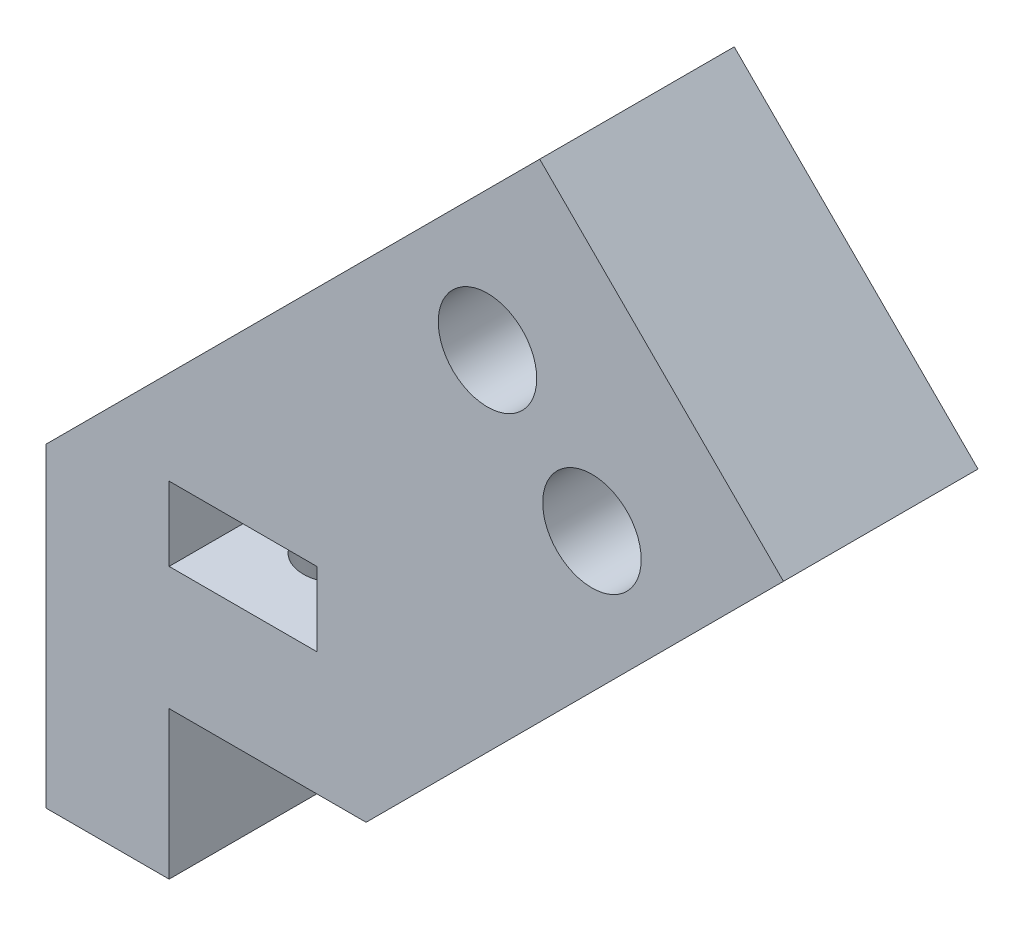
ISO-10303-21;
HEADER;
FILE_DESCRIPTION(('STEP AP214'),'2;1');
FILE_NAME('part.step','',(''),(''),'','','');
FILE_SCHEMA(('AUTOMOTIVE_DESIGN { 1 0 10303 214 1 1 1 1 }'));
ENDSEC;
DATA;
#1=APPLICATION_CONTEXT('core data for automotive mechanical design processes');
#2=APPLICATION_PROTOCOL_DEFINITION('international standard','automotive_design',2000,#1);
#3=PRODUCT_CONTEXT('',#1,'mechanical');
#4=PRODUCT('Part','Part','',(#3));
#5=PRODUCT_RELATED_PRODUCT_CATEGORY('part','',(#4));
#6=PRODUCT_DEFINITION_FORMATION('','',#4);
#7=PRODUCT_DEFINITION_CONTEXT('part definition',#1,'design');
#8=PRODUCT_DEFINITION('design','',#6,#7);
#9=PRODUCT_DEFINITION_SHAPE('','',#8);
#10=(LENGTH_UNIT() NAMED_UNIT(*) SI_UNIT(.MILLI.,.METRE.));
#11=(NAMED_UNIT(*) PLANE_ANGLE_UNIT() SI_UNIT($,.RADIAN.));
#12=(NAMED_UNIT(*) SI_UNIT($,.STERADIAN.) SOLID_ANGLE_UNIT());
#13=UNCERTAINTY_MEASURE_WITH_UNIT(LENGTH_MEASURE(1.E-05),#10,'distance_accuracy_value','');
#14=(GEOMETRIC_REPRESENTATION_CONTEXT(3) GLOBAL_UNCERTAINTY_ASSIGNED_CONTEXT((#13)) GLOBAL_UNIT_ASSIGNED_CONTEXT((#10,
#11,#12)) REPRESENTATION_CONTEXT('',''));
#15=CARTESIAN_POINT('',(0.,0.,0.));
#16=DIRECTION('',(0.,0.,1.));
#17=DIRECTION('',(1.,0.,0.));
#18=AXIS2_PLACEMENT_3D('',#15,#16,#17);
#19=CARTESIAN_POINT('',(-27.,32.8492424049175,-3.95));
#20=DIRECTION('',(0.,-1.,0.));
#21=DIRECTION('',(0.,0.,-1.));
#22=AXIS2_PLACEMENT_3D('',#19,#20,#21);
#23=CYLINDRICAL_SURFACE('',#22,1.5);
#24=CARTESIAN_POINT('',(-27.,14.,-3.95));
#25=DIRECTION('',(0.,1.,0.));
#26=DIRECTION('',(0.,0.,1.));
#27=AXIS2_PLACEMENT_3D('',#24,#25,#26);
#28=CIRCLE('',#27,1.5);
#29=CARTESIAN_POINT('',(-27.,14.,-2.45));
#30=VERTEX_POINT('',#29);
#31=EDGE_CURVE('E37',#30,#30,#28,.F.);
#32=ORIENTED_EDGE('',*,*,#31,.T.);
#33=EDGE_LOOP('',(#32));
#34=FACE_BOUND('',#33,.T.);
#35=CARTESIAN_POINT('',(-27.,20.7989898732233,-3.95));
#36=DIRECTION('',(-0.707106781186548,0.707106781186548,0.));
#37=DIRECTION('',(-0.707106781186548,-0.707106781186548,0.));
#38=AXIS2_PLACEMENT_3D('',#35,#36,#37);
#39=ELLIPSE('',#38,2.12132034355964,1.5);
#40=CARTESIAN_POINT('',(-28.5,19.2989898732233,-3.95));
#41=VERTEX_POINT('',#40);
#42=EDGE_CURVE('E158',#41,#41,#39,.T.);
#43=ORIENTED_EDGE('',*,*,#42,.T.);
#44=EDGE_LOOP('',(#43));
#45=FACE_BOUND('',#44,.T.);
#46=ADVANCED_FACE('F33',(#34,#45),#23,.F.);
#47=CARTESIAN_POINT('',(-30.,0.,-52.3528975432684));
#48=DIRECTION('',(1.,0.,0.));
#49=DIRECTION('',(0.,0.,-1.));
#50=AXIS2_PLACEMENT_3D('',#47,#48,#49);
#51=PLANE('',#50);
#52=DIRECTION('',(0.,-1.,0.));
#53=VECTOR('',#52,1.);
#54=CARTESIAN_POINT('',(-30.,0.,-7.9));
#55=LINE('',#54,#53);
#56=CARTESIAN_POINT('',(-30.,6.,-7.90000000000002));
#57=VERTEX_POINT('',#56);
#58=CARTESIAN_POINT('',(-30.,0.,-7.9));
#59=VERTEX_POINT('',#58);
#60=EDGE_CURVE('E160',#57,#59,#55,.T.);
#61=ORIENTED_EDGE('',*,*,#60,.F.);
#62=DIRECTION('',(0.,0.,1.));
#63=VECTOR('',#62,1.);
#64=CARTESIAN_POINT('',(-30.,6.,-52.3528975432684));
#65=LINE('',#64,#63);
#66=CARTESIAN_POINT('',(-30.,6.,0.));
#67=VERTEX_POINT('',#66);
#68=EDGE_CURVE('E212',#57,#67,#65,.T.);
#69=ORIENTED_EDGE('',*,*,#68,.T.);
#70=DIRECTION('',(0.,1.,0.));
#71=VECTOR('',#70,1.);
#72=CARTESIAN_POINT('',(-30.,0.,0.));
#73=LINE('',#72,#71);
#74=CARTESIAN_POINT('',(-30.,0.,0.));
#75=VERTEX_POINT('',#74);
#76=EDGE_CURVE('E184',#75,#67,#73,.T.);
#77=ORIENTED_EDGE('',*,*,#76,.F.);
#78=DIRECTION('',(0.,0.,1.));
#79=VECTOR('',#78,1.);
#80=CARTESIAN_POINT('',(-30.,0.,-52.3528975432684));
#81=LINE('',#80,#79);
#82=EDGE_CURVE('E202',#59,#75,#81,.T.);
#83=ORIENTED_EDGE('',*,*,#82,.F.);
#84=EDGE_LOOP('',(#61,#69,#77,#83));
#85=FACE_BOUND('',#84,.T.);
#86=ADVANCED_FACE('F239',(#85),#51,.T.);
#87=CARTESIAN_POINT('',(-30.,6.,-52.3528975432684));
#88=DIRECTION('',(0.,-1.,0.));
#89=DIRECTION('',(0.,0.,-1.));
#90=AXIS2_PLACEMENT_3D('',#87,#88,#89);
#91=PLANE('',#90);
#92=CARTESIAN_POINT('',(-27.,6.,-3.95));
#93=DIRECTION('',(0.,-1.,0.));
#94=DIRECTION('',(0.,0.,-1.));
#95=AXIS2_PLACEMENT_3D('',#92,#93,#94);
#96=CIRCLE('',#95,1.5);
#97=CARTESIAN_POINT('',(-27.,6.,-5.45));
#98=VERTEX_POINT('',#97);
#99=EDGE_CURVE('E156',#98,#98,#96,.T.);
#100=ORIENTED_EDGE('',*,*,#99,.F.);
#101=EDGE_LOOP('',(#100));
#102=FACE_BOUND('',#101,.T.);
#103=DIRECTION('',(-1.,0.,0.));
#104=VECTOR('',#103,1.);
#105=CARTESIAN_POINT('',(-30.,6.,-7.9));
#106=LINE('',#105,#104);
#107=CARTESIAN_POINT('',(-22.,6.,-7.9));
#108=VERTEX_POINT('',#107);
#109=EDGE_CURVE('E163',#108,#57,#106,.T.);
#110=ORIENTED_EDGE('',*,*,#109,.F.);
#111=DIRECTION('',(0.,0.,1.));
#112=VECTOR('',#111,1.);
#113=CARTESIAN_POINT('',(-22.,6.,-52.3528975432684));
#114=LINE('',#113,#112);
#115=CARTESIAN_POINT('',(-22.,6.,0.));
#116=VERTEX_POINT('',#115);
#117=EDGE_CURVE('E210',#108,#116,#114,.T.);
#118=ORIENTED_EDGE('',*,*,#117,.T.);
#119=DIRECTION('',(1.,0.,0.));
#120=VECTOR('',#119,1.);
#121=CARTESIAN_POINT('',(-30.,6.,0.));
#122=LINE('',#121,#120);
#123=EDGE_CURVE('E187',#67,#116,#122,.T.);
#124=ORIENTED_EDGE('',*,*,#123,.F.);
#125=ORIENTED_EDGE('',*,*,#68,.F.);
#126=EDGE_LOOP('',(#110,#118,#124,#125));
#127=FACE_BOUND('',#126,.T.);
#128=ADVANCED_FACE('F243',(#102,#127),#91,.T.);
#129=CARTESIAN_POINT('',(-22.,6.,-52.3528975432684));
#130=DIRECTION('',(0.707106781186547,-0.707106781186548,0.));
#131=DIRECTION('',(0.707106781186548,0.707106781186547,0.));
#132=AXIS2_PLACEMENT_3D('',#129,#130,#131);
#133=PLANE('',#132);
#134=DIRECTION('',(-0.707106781186548,-0.707106781186547,0.));
#135=VECTOR('',#134,1.);
#136=CARTESIAN_POINT('',(-22.,6.,-7.9));
#137=LINE('',#136,#135);
#138=CARTESIAN_POINT('',(-5.05025253169416,22.9497474683058,-7.9));
#139=VERTEX_POINT('',#138);
#140=EDGE_CURVE('E165',#139,#108,#137,.T.);
#141=ORIENTED_EDGE('',*,*,#140,.F.);
#142=DIRECTION('',(0.,0.,1.));
#143=VECTOR('',#142,1.);
#144=CARTESIAN_POINT('',(-5.05025253169416,22.9497474683058,-52.3528975432684));
#145=LINE('',#144,#143);
#146=CARTESIAN_POINT('',(-5.05025253169416,22.9497474683058,0.));
#147=VERTEX_POINT('',#146);
#148=EDGE_CURVE('E208',#139,#147,#145,.T.);
#149=ORIENTED_EDGE('',*,*,#148,.T.);
#150=DIRECTION('',(0.707106781186548,0.707106781186547,0.));
#151=VECTOR('',#150,1.);
#152=CARTESIAN_POINT('',(-22.,6.,0.));
#153=LINE('',#152,#151);
#154=EDGE_CURVE('E190',#116,#147,#153,.T.);
#155=ORIENTED_EDGE('',*,*,#154,.F.);
#156=ORIENTED_EDGE('',*,*,#117,.F.);
#157=EDGE_LOOP('',(#141,#149,#155,#156));
#158=FACE_BOUND('',#157,.T.);
#159=ADVANCED_FACE('F272',(#158),#133,.T.);
#160=CARTESIAN_POINT('',(-5.05025253169416,22.9497474683058,-52.3528975432684));
#161=DIRECTION('',(0.707106781186548,0.707106781186547,0.));
#162=DIRECTION('',(-0.707106781186547,0.707106781186548,0.));
#163=AXIS2_PLACEMENT_3D('',#160,#161,#162);
#164=PLANE('',#163);
#165=DIRECTION('',(0.707106781186547,-0.707106781186548,0.));
#166=VECTOR('',#165,1.);
#167=CARTESIAN_POINT('',(-5.05025253169416,22.9497474683058,-7.9));
#168=LINE('',#167,#166);
#169=CARTESIAN_POINT('',(-14.9497474683058,32.8492424049175,-7.9));
#170=VERTEX_POINT('',#169);
#171=EDGE_CURVE('E168',#170,#139,#168,.T.);
#172=ORIENTED_EDGE('',*,*,#171,.F.);
#173=DIRECTION('',(0.,0.,1.));
#174=VECTOR('',#173,1.);
#175=CARTESIAN_POINT('',(-14.9497474683058,32.8492424049175,-52.3528975432684));
#176=LINE('',#175,#174);
#177=CARTESIAN_POINT('',(-14.9497474683058,32.8492424049175,0.));
#178=VERTEX_POINT('',#177);
#179=EDGE_CURVE('E206',#170,#178,#176,.T.);
#180=ORIENTED_EDGE('',*,*,#179,.T.);
#181=DIRECTION('',(-0.707106781186547,0.707106781186548,0.));
#182=VECTOR('',#181,1.);
#183=CARTESIAN_POINT('',(-5.05025253169416,22.9497474683058,0.));
#184=LINE('',#183,#182);
#185=EDGE_CURVE('E193',#147,#178,#184,.T.);
#186=ORIENTED_EDGE('',*,*,#185,.F.);
#187=ORIENTED_EDGE('',*,*,#148,.F.);
#188=EDGE_LOOP('',(#172,#180,#186,#187));
#189=FACE_BOUND('',#188,.T.);
#190=ADVANCED_FACE('F268',(#189),#164,.T.);
#191=CARTESIAN_POINT('',(-14.9497474683058,32.8492424049175,-52.3528975432684));
#192=DIRECTION('',(-0.707106781186548,0.707106781186548,0.));
#193=DIRECTION('',(-0.707106781186548,-0.707106781186548,0.));
#194=AXIS2_PLACEMENT_3D('',#191,#192,#193);
#195=PLANE('',#194);
#196=ORIENTED_EDGE('',*,*,#42,.F.);
#197=EDGE_LOOP('',(#196));
#198=FACE_BOUND('',#197,.T.);
#199=DIRECTION('',(0.707106781186548,0.707106781186548,0.));
#200=VECTOR('',#199,1.);
#201=CARTESIAN_POINT('',(-14.9497474683058,32.8492424049175,-7.9));
#202=LINE('',#201,#200);
#203=CARTESIAN_POINT('',(-35.,12.7989898732233,-7.9));
#204=VERTEX_POINT('',#203);
#205=EDGE_CURVE('E170',#204,#170,#202,.T.);
#206=ORIENTED_EDGE('',*,*,#205,.F.);
#207=DIRECTION('',(0.,0.,1.));
#208=VECTOR('',#207,1.);
#209=CARTESIAN_POINT('',(-35.,12.7989898732233,-52.3528975432684));
#210=LINE('',#209,#208);
#211=CARTESIAN_POINT('',(-35.,12.7989898732233,0.));
#212=VERTEX_POINT('',#211);
#213=EDGE_CURVE('E204',#204,#212,#210,.T.);
#214=ORIENTED_EDGE('',*,*,#213,.T.);
#215=DIRECTION('',(-0.707106781186547,-0.707106781186547,0.));
#216=VECTOR('',#215,1.);
#217=CARTESIAN_POINT('',(-14.9497474683058,32.8492424049175,0.));
#218=LINE('',#217,#216);
#219=EDGE_CURVE('E196',#178,#212,#218,.T.);
#220=ORIENTED_EDGE('',*,*,#219,.F.);
#221=ORIENTED_EDGE('',*,*,#179,.F.);
#222=EDGE_LOOP('',(#206,#214,#220,#221));
#223=FACE_BOUND('',#222,.T.);
#224=ADVANCED_FACE('F264',(#198,#223),#195,.T.);
#225=CARTESIAN_POINT('',(-35.,12.7989898732233,-52.3528975432684));
#226=DIRECTION('',(-1.,0.,0.));
#227=DIRECTION('',(0.,0.,1.));
#228=AXIS2_PLACEMENT_3D('',#225,#226,#227);
#229=PLANE('',#228);
#230=DIRECTION('',(0.,1.,0.));
#231=VECTOR('',#230,1.);
#232=CARTESIAN_POINT('',(-35.,12.7989898732233,-7.9));
#233=LINE('',#232,#231);
#234=CARTESIAN_POINT('',(-35.,0.,-7.9));
#235=VERTEX_POINT('',#234);
#236=EDGE_CURVE('E172',#235,#204,#233,.T.);
#237=ORIENTED_EDGE('',*,*,#236,.F.);
#238=DIRECTION('',(0.,0.,1.));
#239=VECTOR('',#238,1.);
#240=CARTESIAN_POINT('',(-35.,0.,-52.3528975432684));
#241=LINE('',#240,#239);
#242=CARTESIAN_POINT('',(-35.,0.,0.));
#243=VERTEX_POINT('',#242);
#244=EDGE_CURVE('E166',#235,#243,#241,.T.);
#245=ORIENTED_EDGE('',*,*,#244,.T.);
#246=DIRECTION('',(0.,-1.,0.));
#247=VECTOR('',#246,1.);
#248=CARTESIAN_POINT('',(-35.,12.7989898732233,0.));
#249=LINE('',#248,#247);
#250=EDGE_CURVE('E199',#212,#243,#249,.T.);
#251=ORIENTED_EDGE('',*,*,#250,.F.);
#252=ORIENTED_EDGE('',*,*,#213,.F.);
#253=EDGE_LOOP('',(#237,#245,#251,#252));
#254=FACE_BOUND('',#253,.T.);
#255=ADVANCED_FACE('F261',(#254),#229,.T.);
#256=CARTESIAN_POINT('',(-35.,0.,-52.3528975432684));
#257=DIRECTION('',(0.,-1.,0.));
#258=DIRECTION('',(0.,0.,-1.));
#259=AXIS2_PLACEMENT_3D('',#256,#257,#258);
#260=PLANE('',#259);
#261=DIRECTION('',(-1.,0.,0.));
#262=VECTOR('',#261,1.);
#263=CARTESIAN_POINT('',(-35.,0.,-7.9));
#264=LINE('',#263,#262);
#265=EDGE_CURVE('E162',#59,#235,#264,.T.);
#266=ORIENTED_EDGE('',*,*,#265,.F.);
#267=ORIENTED_EDGE('',*,*,#82,.T.);
#268=DIRECTION('',(1.,0.,0.));
#269=VECTOR('',#268,1.);
#270=CARTESIAN_POINT('',(-35.,0.,0.));
#271=LINE('',#270,#269);
#272=EDGE_CURVE('E181',#243,#75,#271,.T.);
#273=ORIENTED_EDGE('',*,*,#272,.F.);
#274=ORIENTED_EDGE('',*,*,#244,.F.);
#275=EDGE_LOOP('',(#266,#267,#273,#274));
#276=FACE_BOUND('',#275,.T.);
#277=ADVANCED_FACE('F35',(#276),#260,.T.);
#278=CARTESIAN_POINT('',(-17.0710678118655,25.0710678118655,-52.3528975432684));
#279=DIRECTION('',(0.,0.,1.));
#280=DIRECTION('',(1.,0.,0.));
#281=AXIS2_PLACEMENT_3D('',#278,#279,#280);
#282=CYLINDRICAL_SURFACE('',#281,2.);
#283=CARTESIAN_POINT('',(-17.0710678118655,25.0710678118655,-7.9));
#284=DIRECTION('',(0.,0.,1.));
#285=DIRECTION('',(1.,0.,0.));
#286=AXIS2_PLACEMENT_3D('',#283,#284,#285);
#287=CIRCLE('',#286,2.);
#288=CARTESIAN_POINT('',(-15.0710678118655,25.0710678118655,-7.90000000000001));
#289=VERTEX_POINT('',#288);
#290=EDGE_CURVE('E11',#289,#289,#287,.F.);
#291=CARTESIAN_POINT('',(-17.0710678118655,25.0710678118655,0.));
#292=DIRECTION('',(0.,0.,1.));
#293=DIRECTION('',(1.,0.,0.));
#294=AXIS2_PLACEMENT_3D('',#291,#292,#293);
#295=CIRCLE('',#294,2.);
#296=CARTESIAN_POINT('',(-15.0710678118655,25.0710678118655,0.));
#297=VERTEX_POINT('',#296);
#298=EDGE_CURVE('E178',#297,#297,#295,.T.);
#299=CARTESIAN_POINT('',(-15.0710678118655,25.0710678118655,-7.90000000000001));
#300=CARTESIAN_POINT('',(-15.0710678118655,25.0710678118655,-7.81770833333334));
#301=CARTESIAN_POINT('',(-15.0710678118655,25.0710678118655,-7.73541666666668));
#302=CARTESIAN_POINT('',(-15.0710678118655,25.0710678118655,-7.57083333333334));
#303=CARTESIAN_POINT('',(-15.0710678118655,25.0710678118655,-7.48854166666668));
#304=CARTESIAN_POINT('',(-15.0710678118655,25.0710678118655,-7.32395833333334));
#305=CARTESIAN_POINT('',(-15.0710678118655,25.0710678118655,-7.24166666666668));
#306=CARTESIAN_POINT('',(-15.0710678118655,25.0710678118655,-7.07708333333334));
#307=CARTESIAN_POINT('',(-15.0710678118655,25.0710678118655,-6.99479166666668));
#308=CARTESIAN_POINT('',(-15.0710678118655,25.0710678118655,-6.83020833333334));
#309=CARTESIAN_POINT('',(-15.0710678118655,25.0710678118655,-6.74791666666668));
#310=CARTESIAN_POINT('',(-15.0710678118655,25.0710678118655,-6.58333333333334));
#311=CARTESIAN_POINT('',(-15.0710678118655,25.0710678118655,-6.50104166666667));
#312=CARTESIAN_POINT('',(-15.0710678118655,25.0710678118655,-6.33645833333334));
#313=CARTESIAN_POINT('',(-15.0710678118655,25.0710678118655,-6.25416666666667));
#314=CARTESIAN_POINT('',(-15.0710678118655,25.0710678118655,-6.08958333333334));
#315=CARTESIAN_POINT('',(-15.0710678118655,25.0710678118655,-6.00729166666667));
#316=CARTESIAN_POINT('',(-15.0710678118655,25.0710678118655,-5.84270833333334));
#317=CARTESIAN_POINT('',(-15.0710678118655,25.0710678118655,-5.76041666666668));
#318=CARTESIAN_POINT('',(-15.0710678118655,25.0710678118655,-5.59583333333335));
#319=CARTESIAN_POINT('',(-15.0710678118655,25.0710678118655,-5.51354166666668));
#320=CARTESIAN_POINT('',(-15.0710678118655,25.0710678118655,-5.34895833333335));
#321=CARTESIAN_POINT('',(-15.0710678118655,25.0710678118655,-5.26666666666668));
#322=CARTESIAN_POINT('',(-15.0710678118655,25.0710678118655,-5.10208333333334));
#323=CARTESIAN_POINT('',(-15.0710678118655,25.0710678118655,-5.01979166666668));
#324=CARTESIAN_POINT('',(-15.0710678118655,25.0710678118655,-4.85520833333334));
#325=CARTESIAN_POINT('',(-15.0710678118655,25.0710678118655,-4.77291666666668));
#326=CARTESIAN_POINT('',(-15.0710678118655,25.0710678118655,-4.60833333333334));
#327=CARTESIAN_POINT('',(-15.0710678118655,25.0710678118655,-4.52604166666668));
#328=CARTESIAN_POINT('',(-15.0710678118655,25.0710678118655,-4.36145833333334));
#329=CARTESIAN_POINT('',(-15.0710678118655,25.0710678118655,-4.27916666666668));
#330=CARTESIAN_POINT('',(-15.0710678118655,25.0710678118655,-4.11458333333334));
#331=CARTESIAN_POINT('',(-15.0710678118655,25.0710678118655,-4.03229166666668));
#332=CARTESIAN_POINT('',(-15.0710678118655,25.0710678118655,-3.86770833333334));
#333=CARTESIAN_POINT('',(-15.0710678118655,25.0710678118655,-3.78541666666668));
#334=CARTESIAN_POINT('',(-15.0710678118655,25.0710678118655,-3.62083333333334));
#335=CARTESIAN_POINT('',(-15.0710678118655,25.0710678118655,-3.53854166666667));
#336=CARTESIAN_POINT('',(-15.0710678118655,25.0710678118655,-3.37395833333334));
#337=CARTESIAN_POINT('',(-15.0710678118655,25.0710678118655,-3.29166666666667));
#338=CARTESIAN_POINT('',(-15.0710678118655,25.0710678118655,-3.12708333333334));
#339=CARTESIAN_POINT('',(-15.0710678118655,25.0710678118655,-3.04479166666667));
#340=CARTESIAN_POINT('',(-15.0710678118655,25.0710678118655,-2.88020833333334));
#341=CARTESIAN_POINT('',(-15.0710678118655,25.0710678118655,-2.79791666666667));
#342=CARTESIAN_POINT('',(-15.0710678118655,25.0710678118655,-2.63333333333334));
#343=CARTESIAN_POINT('',(-15.0710678118655,25.0710678118655,-2.55104166666667));
#344=CARTESIAN_POINT('',(-15.0710678118655,25.0710678118655,-2.38645833333334));
#345=CARTESIAN_POINT('',(-15.0710678118655,25.0710678118655,-2.30416666666667));
#346=CARTESIAN_POINT('',(-15.0710678118655,25.0710678118655,-2.13958333333334));
#347=CARTESIAN_POINT('',(-15.0710678118655,25.0710678118655,-2.05729166666668));
#348=CARTESIAN_POINT('',(-15.0710678118655,25.0710678118655,-1.89270833333334));
#349=CARTESIAN_POINT('',(-15.0710678118655,25.0710678118655,-1.81041666666667));
#350=CARTESIAN_POINT('',(-15.0710678118655,25.0710678118655,-1.64583333333334));
#351=CARTESIAN_POINT('',(-15.0710678118655,25.0710678118655,-1.56354166666667));
#352=CARTESIAN_POINT('',(-15.0710678118655,25.0710678118655,-1.39895833333334));
#353=CARTESIAN_POINT('',(-15.0710678118655,25.0710678118655,-1.31666666666668));
#354=CARTESIAN_POINT('',(-15.0710678118655,25.0710678118655,-1.15208333333334));
#355=CARTESIAN_POINT('',(-15.0710678118655,25.0710678118655,-1.06979166666668));
#356=CARTESIAN_POINT('',(-15.0710678118655,25.0710678118655,-0.905208333333342));
#357=CARTESIAN_POINT('',(-15.0710678118655,25.0710678118655,-0.822916666666676));
#358=CARTESIAN_POINT('',(-15.0710678118655,25.0710678118655,-0.658333333333342));
#359=CARTESIAN_POINT('',(-15.0710678118655,25.0710678118655,-0.576041666666675));
#360=CARTESIAN_POINT('',(-15.0710678118655,25.0710678118655,-0.411458333333341));
#361=CARTESIAN_POINT('',(-15.0710678118655,25.0710678118655,-0.329166666666674));
#362=CARTESIAN_POINT('',(-15.0710678118655,25.0710678118655,-0.164583333333341));
#363=CARTESIAN_POINT('',(-15.0710678118655,25.0710678118655,-0.0822916666666737));
#364=CARTESIAN_POINT('',(-15.0710678118655,25.0710678118655,0.));
#365=B_SPLINE_CURVE_WITH_KNOTS('',3,(#299,#300,#301,#302,#303,#304,#305,#306,#307,#308,#309,
#310,#311,#312,#313,#314,#315,#316,#317,#318,#319,#320,#321,#322,#323,#324,#325,#326,#327,#328,
#329,#330,#331,#332,#333,#334,#335,#336,#337,#338,#339,#340,#341,#342,#343,#344,#345,#346,#347,
#348,#349,#350,#351,#352,#353,#354,#355,#356,#357,#358,#359,#360,#361,#362,#363,#364),
.UNSPECIFIED.,.F.,.F.,(4,2,2,2,2,2,2,2,2,2,2,2,2,2,2,2,2,2,2,2,2,2,2,2,2,2,2,2,2,2,2,2,4),(0.,
0.246875000000001,0.493750000000001,0.740625000000002,0.987500000000002,1.234375,1.48125,
1.728125,1.975,2.221875,2.46875,2.715625,2.9625,3.209375,3.45625,3.703125,3.95,4.196875,4.44375,
4.690625,4.9375,5.184375,5.43125000000001,5.67812500000001,5.925,6.17187500000001,6.41875,
6.665625,6.9125,7.159375,7.40625,7.653125,7.9),.UNSPECIFIED.);
#366=EDGE_CURVE('BSEAM254',#289,#297,#365,.T.);
#367=ORIENTED_EDGE('',*,*,#290,.T.);
#368=ORIENTED_EDGE('',*,*,#298,.T.);
#369=ORIENTED_EDGE('',*,*,#366,.T.);
#370=ORIENTED_EDGE('',*,*,#366,.F.);
#371=EDGE_LOOP('',(#367,#369,#368,#370));
#372=FACE_BOUND('',#371,.T.);
#373=ADVANCED_FACE('F254',(#372),#282,.F.);
#374=CARTESIAN_POINT('',(0.,0.,0.));
#375=DIRECTION('',(0.,0.,1.));
#376=DIRECTION('',(1.,0.,0.));
#377=AXIS2_PLACEMENT_3D('',#374,#375,#376);
#378=PLANE('',#377);
#379=DIRECTION('',(0.,-1.,0.));
#380=VECTOR('',#379,1.);
#381=CARTESIAN_POINT('',(-30.,14.,0.));
#382=LINE('',#381,#380);
#383=CARTESIAN_POINT('',(-30.,14.,0.));
#384=VERTEX_POINT('',#383);
#385=CARTESIAN_POINT('',(-30.,11.,0.));
#386=VERTEX_POINT('',#385);
#387=EDGE_CURVE('E50',#384,#386,#382,.T.);
#388=ORIENTED_EDGE('',*,*,#387,.F.);
#389=DIRECTION('',(-1.,0.,0.));
#390=VECTOR('',#389,1.);
#391=CARTESIAN_POINT('',(-24.,14.,0.));
#392=LINE('',#391,#390);
#393=CARTESIAN_POINT('',(-24.,14.,0.));
#394=VERTEX_POINT('',#393);
#395=EDGE_CURVE('E137',#394,#384,#392,.T.);
#396=ORIENTED_EDGE('',*,*,#395,.F.);
#397=DIRECTION('',(0.,1.,0.));
#398=VECTOR('',#397,1.);
#399=CARTESIAN_POINT('',(-24.,11.,0.));
#400=LINE('',#399,#398);
#401=CARTESIAN_POINT('',(-24.,11.,0.));
#402=VERTEX_POINT('',#401);
#403=EDGE_CURVE('E140',#402,#394,#400,.T.);
#404=ORIENTED_EDGE('',*,*,#403,.F.);
#405=DIRECTION('',(1.,0.,0.));
#406=VECTOR('',#405,1.);
#407=CARTESIAN_POINT('',(-30.,11.,0.));
#408=LINE('',#407,#406);
#409=EDGE_CURVE('E146',#386,#402,#408,.T.);
#410=ORIENTED_EDGE('',*,*,#409,.F.);
#411=EDGE_LOOP('',(#388,#396,#404,#410));
#412=FACE_BOUND('',#411,.T.);
#413=CARTESIAN_POINT('',(-12.8284271247462,20.8284271247462,0.));
#414=DIRECTION('',(0.,0.,1.));
#415=DIRECTION('',(1.,0.,0.));
#416=AXIS2_PLACEMENT_3D('',#413,#414,#415);
#417=CIRCLE('',#416,2.);
#418=CARTESIAN_POINT('',(-10.8284271247462,20.8284271247462,0.));
#419=VERTEX_POINT('',#418);
#420=EDGE_CURVE('E175',#419,#419,#417,.T.);
#421=ORIENTED_EDGE('',*,*,#420,.F.);
#422=EDGE_LOOP('',(#421));
#423=FACE_BOUND('',#422,.T.);
#424=ORIENTED_EDGE('',*,*,#298,.F.);
#425=EDGE_LOOP('',(#424));
#426=FACE_BOUND('',#425,.T.);
#427=ORIENTED_EDGE('',*,*,#272,.T.);
#428=ORIENTED_EDGE('',*,*,#76,.T.);
#429=ORIENTED_EDGE('',*,*,#123,.T.);
#430=ORIENTED_EDGE('',*,*,#154,.T.);
#431=ORIENTED_EDGE('',*,*,#185,.T.);
#432=ORIENTED_EDGE('',*,*,#219,.T.);
#433=ORIENTED_EDGE('',*,*,#250,.T.);
#434=EDGE_LOOP('',(#427,#428,#429,#430,#431,#432,#433));
#435=FACE_BOUND('',#434,.T.);
#436=ADVANCED_FACE('F252',(#412,#423,#426,#435),#378,.T.);
#437=CARTESIAN_POINT('',(-12.8284271247462,20.8284271247462,-52.3528975432684));
#438=DIRECTION('',(0.,0.,1.));
#439=DIRECTION('',(1.,0.,0.));
#440=AXIS2_PLACEMENT_3D('',#437,#438,#439);
#441=CYLINDRICAL_SURFACE('',#440,2.);
#442=CARTESIAN_POINT('',(-12.8284271247462,20.8284271247462,-7.9));
#443=DIRECTION('',(0.,0.,1.));
#444=DIRECTION('',(1.,0.,0.));
#445=AXIS2_PLACEMENT_3D('',#442,#443,#444);
#446=CIRCLE('',#445,2.);
#447=CARTESIAN_POINT('',(-10.8284271247462,20.8284271247462,-7.90000000000001));
#448=VERTEX_POINT('',#447);
#449=EDGE_CURVE('E42',#448,#448,#446,.F.);
#450=CARTESIAN_POINT('',(-10.8284271247462,20.8284271247462,-7.90000000000001));
#451=CARTESIAN_POINT('',(-10.8284271247462,20.8284271247462,-7.81770833333334));
#452=CARTESIAN_POINT('',(-10.8284271247462,20.8284271247462,-7.73541666666668));
#453=CARTESIAN_POINT('',(-10.8284271247462,20.8284271247462,-7.57083333333334));
#454=CARTESIAN_POINT('',(-10.8284271247462,20.8284271247462,-7.48854166666668));
#455=CARTESIAN_POINT('',(-10.8284271247462,20.8284271247462,-7.32395833333334));
#456=CARTESIAN_POINT('',(-10.8284271247462,20.8284271247462,-7.24166666666668));
#457=CARTESIAN_POINT('',(-10.8284271247462,20.8284271247462,-7.07708333333334));
#458=CARTESIAN_POINT('',(-10.8284271247462,20.8284271247462,-6.99479166666668));
#459=CARTESIAN_POINT('',(-10.8284271247462,20.8284271247462,-6.83020833333334));
#460=CARTESIAN_POINT('',(-10.8284271247462,20.8284271247462,-6.74791666666668));
#461=CARTESIAN_POINT('',(-10.8284271247462,20.8284271247462,-6.58333333333334));
#462=CARTESIAN_POINT('',(-10.8284271247462,20.8284271247462,-6.50104166666667));
#463=CARTESIAN_POINT('',(-10.8284271247462,20.8284271247462,-6.33645833333334));
#464=CARTESIAN_POINT('',(-10.8284271247462,20.8284271247462,-6.25416666666667));
#465=CARTESIAN_POINT('',(-10.8284271247462,20.8284271247462,-6.08958333333334));
#466=CARTESIAN_POINT('',(-10.8284271247462,20.8284271247462,-6.00729166666667));
#467=CARTESIAN_POINT('',(-10.8284271247462,20.8284271247462,-5.84270833333334));
#468=CARTESIAN_POINT('',(-10.8284271247462,20.8284271247462,-5.76041666666668));
#469=CARTESIAN_POINT('',(-10.8284271247462,20.8284271247462,-5.59583333333335));
#470=CARTESIAN_POINT('',(-10.8284271247462,20.8284271247462,-5.51354166666668));
#471=CARTESIAN_POINT('',(-10.8284271247462,20.8284271247462,-5.34895833333335));
#472=CARTESIAN_POINT('',(-10.8284271247462,20.8284271247462,-5.26666666666668));
#473=CARTESIAN_POINT('',(-10.8284271247462,20.8284271247462,-5.10208333333334));
#474=CARTESIAN_POINT('',(-10.8284271247462,20.8284271247462,-5.01979166666668));
#475=CARTESIAN_POINT('',(-10.8284271247462,20.8284271247462,-4.85520833333334));
#476=CARTESIAN_POINT('',(-10.8284271247462,20.8284271247462,-4.77291666666668));
#477=CARTESIAN_POINT('',(-10.8284271247462,20.8284271247462,-4.60833333333334));
#478=CARTESIAN_POINT('',(-10.8284271247462,20.8284271247462,-4.52604166666668));
#479=CARTESIAN_POINT('',(-10.8284271247462,20.8284271247462,-4.36145833333334));
#480=CARTESIAN_POINT('',(-10.8284271247462,20.8284271247462,-4.27916666666668));
#481=CARTESIAN_POINT('',(-10.8284271247462,20.8284271247462,-4.11458333333334));
#482=CARTESIAN_POINT('',(-10.8284271247462,20.8284271247462,-4.03229166666668));
#483=CARTESIAN_POINT('',(-10.8284271247462,20.8284271247462,-3.86770833333334));
#484=CARTESIAN_POINT('',(-10.8284271247462,20.8284271247462,-3.78541666666668));
#485=CARTESIAN_POINT('',(-10.8284271247462,20.8284271247462,-3.62083333333334));
#486=CARTESIAN_POINT('',(-10.8284271247462,20.8284271247462,-3.53854166666667));
#487=CARTESIAN_POINT('',(-10.8284271247462,20.8284271247462,-3.37395833333334));
#488=CARTESIAN_POINT('',(-10.8284271247462,20.8284271247462,-3.29166666666667));
#489=CARTESIAN_POINT('',(-10.8284271247462,20.8284271247462,-3.12708333333334));
#490=CARTESIAN_POINT('',(-10.8284271247462,20.8284271247462,-3.04479166666667));
#491=CARTESIAN_POINT('',(-10.8284271247462,20.8284271247462,-2.88020833333334));
#492=CARTESIAN_POINT('',(-10.8284271247462,20.8284271247462,-2.79791666666667));
#493=CARTESIAN_POINT('',(-10.8284271247462,20.8284271247462,-2.63333333333334));
#494=CARTESIAN_POINT('',(-10.8284271247462,20.8284271247462,-2.55104166666667));
#495=CARTESIAN_POINT('',(-10.8284271247462,20.8284271247462,-2.38645833333334));
#496=CARTESIAN_POINT('',(-10.8284271247462,20.8284271247462,-2.30416666666667));
#497=CARTESIAN_POINT('',(-10.8284271247462,20.8284271247462,-2.13958333333334));
#498=CARTESIAN_POINT('',(-10.8284271247462,20.8284271247462,-2.05729166666668));
#499=CARTESIAN_POINT('',(-10.8284271247462,20.8284271247462,-1.89270833333334));
#500=CARTESIAN_POINT('',(-10.8284271247462,20.8284271247462,-1.81041666666667));
#501=CARTESIAN_POINT('',(-10.8284271247462,20.8284271247462,-1.64583333333334));
#502=CARTESIAN_POINT('',(-10.8284271247462,20.8284271247462,-1.56354166666667));
#503=CARTESIAN_POINT('',(-10.8284271247462,20.8284271247462,-1.39895833333334));
#504=CARTESIAN_POINT('',(-10.8284271247462,20.8284271247462,-1.31666666666668));
#505=CARTESIAN_POINT('',(-10.8284271247462,20.8284271247462,-1.15208333333334));
#506=CARTESIAN_POINT('',(-10.8284271247462,20.8284271247462,-1.06979166666668));
#507=CARTESIAN_POINT('',(-10.8284271247462,20.8284271247462,-0.905208333333342));
#508=CARTESIAN_POINT('',(-10.8284271247462,20.8284271247462,-0.822916666666676));
#509=CARTESIAN_POINT('',(-10.8284271247462,20.8284271247462,-0.658333333333342));
#510=CARTESIAN_POINT('',(-10.8284271247462,20.8284271247462,-0.576041666666675));
#511=CARTESIAN_POINT('',(-10.8284271247462,20.8284271247462,-0.411458333333341));
#512=CARTESIAN_POINT('',(-10.8284271247462,20.8284271247462,-0.329166666666674));
#513=CARTESIAN_POINT('',(-10.8284271247462,20.8284271247462,-0.164583333333341));
#514=CARTESIAN_POINT('',(-10.8284271247462,20.8284271247462,-0.0822916666666737));
#515=CARTESIAN_POINT('',(-10.8284271247462,20.8284271247462,0.));
#516=B_SPLINE_CURVE_WITH_KNOTS('',3,(#450,#451,#452,#453,#454,#455,#456,#457,#458,#459,#460,
#461,#462,#463,#464,#465,#466,#467,#468,#469,#470,#471,#472,#473,#474,#475,#476,#477,#478,#479,
#480,#481,#482,#483,#484,#485,#486,#487,#488,#489,#490,#491,#492,#493,#494,#495,#496,#497,#498,
#499,#500,#501,#502,#503,#504,#505,#506,#507,#508,#509,#510,#511,#512,#513,#514,#515),
.UNSPECIFIED.,.F.,.F.,(4,2,2,2,2,2,2,2,2,2,2,2,2,2,2,2,2,2,2,2,2,2,2,2,2,2,2,2,2,2,2,2,4),(0.,
0.246875000000001,0.493750000000001,0.740625000000002,0.987500000000002,1.234375,1.48125,
1.728125,1.975,2.221875,2.46875,2.715625,2.9625,3.209375,3.45625,3.703125,3.95,4.196875,4.44375,
4.690625,4.9375,5.184375,5.43125000000001,5.67812500000001,5.925,6.17187500000001,6.41875,
6.665625,6.9125,7.159375,7.40625,7.653125,7.9),.UNSPECIFIED.);
#517=EDGE_CURVE('BSEAM249',#448,#419,#516,.T.);
#518=ORIENTED_EDGE('',*,*,#449,.T.);
#519=ORIENTED_EDGE('',*,*,#420,.T.);
#520=ORIENTED_EDGE('',*,*,#517,.T.);
#521=ORIENTED_EDGE('',*,*,#517,.F.);
#522=EDGE_LOOP('',(#518,#520,#519,#521));
#523=FACE_BOUND('',#522,.T.);
#524=ADVANCED_FACE('F249',(#523),#441,.F.);
#525=CARTESIAN_POINT('',(0.,0.,-7.9));
#526=DIRECTION('',(0.,0.,1.));
#527=DIRECTION('',(1.,0.,0.));
#528=AXIS2_PLACEMENT_3D('',#525,#526,#527);
#529=PLANE('',#528);
#530=DIRECTION('',(-1.,0.,0.));
#531=VECTOR('',#530,1.);
#532=CARTESIAN_POINT('',(-24.,14.,-7.90000000000002));
#533=LINE('',#532,#531);
#534=CARTESIAN_POINT('',(-24.,14.,-7.90000000000002));
#535=VERTEX_POINT('',#534);
#536=CARTESIAN_POINT('',(-30.,14.,-7.90000000000002));
#537=VERTEX_POINT('',#536);
#538=EDGE_CURVE('E126',#535,#537,#533,.T.);
#539=ORIENTED_EDGE('',*,*,#538,.T.);
#540=DIRECTION('',(0.,-1.,0.));
#541=VECTOR('',#540,1.);
#542=CARTESIAN_POINT('',(-30.,14.,-7.90000000000002));
#543=LINE('',#542,#541);
#544=CARTESIAN_POINT('',(-30.,11.,-7.90000000000002));
#545=VERTEX_POINT('',#544);
#546=EDGE_CURVE('E120',#537,#545,#543,.T.);
#547=ORIENTED_EDGE('',*,*,#546,.T.);
#548=DIRECTION('',(1.,0.,0.));
#549=VECTOR('',#548,1.);
#550=CARTESIAN_POINT('',(-30.,11.,-7.90000000000002));
#551=LINE('',#550,#549);
#552=CARTESIAN_POINT('',(-24.,11.,-7.9));
#553=VERTEX_POINT('',#552);
#554=EDGE_CURVE('E129',#545,#553,#551,.T.);
#555=ORIENTED_EDGE('',*,*,#554,.T.);
#556=DIRECTION('',(0.,1.,0.));
#557=VECTOR('',#556,1.);
#558=CARTESIAN_POINT('',(-24.,11.,-7.90000000000002));
#559=LINE('',#558,#557);
#560=EDGE_CURVE('E58',#553,#535,#559,.T.);
#561=ORIENTED_EDGE('',*,*,#560,.T.);
#562=EDGE_LOOP('',(#539,#547,#555,#561));
#563=FACE_BOUND('',#562,.T.);
#564=ORIENTED_EDGE('',*,*,#265,.T.);
#565=ORIENTED_EDGE('',*,*,#236,.T.);
#566=ORIENTED_EDGE('',*,*,#205,.T.);
#567=ORIENTED_EDGE('',*,*,#171,.T.);
#568=ORIENTED_EDGE('',*,*,#140,.T.);
#569=ORIENTED_EDGE('',*,*,#109,.T.);
#570=ORIENTED_EDGE('',*,*,#60,.T.);
#571=EDGE_LOOP('',(#564,#565,#566,#567,#568,#569,#570));
#572=FACE_BOUND('',#571,.T.);
#573=ORIENTED_EDGE('',*,*,#449,.F.);
#574=EDGE_LOOP('',(#573));
#575=FACE_BOUND('',#574,.T.);
#576=ORIENTED_EDGE('',*,*,#290,.F.);
#577=EDGE_LOOP('',(#576));
#578=FACE_BOUND('',#577,.T.);
#579=ADVANCED_FACE('F134',(#563,#572,#575,#578),#529,.F.);
#580=CARTESIAN_POINT('',(-27.,11.,-3.95));
#581=DIRECTION('',(0.,-1.,0.));
#582=DIRECTION('',(0.,0.,-1.));
#583=AXIS2_PLACEMENT_3D('',#580,#581,#582);
#584=CIRCLE('',#583,1.5);
#585=CARTESIAN_POINT('',(-27.,11.,-5.45));
#586=VERTEX_POINT('',#585);
#587=EDGE_CURVE('E152',#586,#586,#584,.F.);
#588=CARTESIAN_POINT('',(-27.,11.,-5.45));
#589=CARTESIAN_POINT('',(-27.,10.9479166666667,-5.45));
#590=CARTESIAN_POINT('',(-27.,10.8958333333333,-5.45));
#591=CARTESIAN_POINT('',(-27.,10.7916666666667,-5.45));
#592=CARTESIAN_POINT('',(-27.,10.7395833333333,-5.45));
#593=CARTESIAN_POINT('',(-27.,10.6354166666667,-5.45));
#594=CARTESIAN_POINT('',(-27.,10.5833333333333,-5.45));
#595=CARTESIAN_POINT('',(-27.,10.4791666666667,-5.45));
#596=CARTESIAN_POINT('',(-27.,10.4270833333333,-5.45));
#597=CARTESIAN_POINT('',(-27.,10.3229166666667,-5.45));
#598=CARTESIAN_POINT('',(-27.,10.2708333333333,-5.45));
#599=CARTESIAN_POINT('',(-27.,10.1666666666667,-5.45));
#600=CARTESIAN_POINT('',(-27.,10.1145833333333,-5.45));
#601=CARTESIAN_POINT('',(-27.,10.0104166666667,-5.45));
#602=CARTESIAN_POINT('',(-27.,9.95833333333333,-5.45));
#603=CARTESIAN_POINT('',(-27.,9.85416666666667,-5.45));
#604=CARTESIAN_POINT('',(-27.,9.80208333333333,-5.45));
#605=CARTESIAN_POINT('',(-27.,9.69791666666667,-5.45));
#606=CARTESIAN_POINT('',(-27.,9.64583333333333,-5.45));
#607=CARTESIAN_POINT('',(-27.,9.54166666666667,-5.45));
#608=CARTESIAN_POINT('',(-27.,9.48958333333333,-5.45));
#609=CARTESIAN_POINT('',(-27.,9.38541666666667,-5.45));
#610=CARTESIAN_POINT('',(-27.,9.33333333333333,-5.45));
#611=CARTESIAN_POINT('',(-27.,9.22916666666667,-5.45));
#612=CARTESIAN_POINT('',(-27.,9.17708333333333,-5.45));
#613=CARTESIAN_POINT('',(-27.,9.07291666666667,-5.45));
#614=CARTESIAN_POINT('',(-27.,9.02083333333333,-5.45));
#615=CARTESIAN_POINT('',(-27.,8.91666666666667,-5.45));
#616=CARTESIAN_POINT('',(-27.,8.86458333333333,-5.45));
#617=CARTESIAN_POINT('',(-27.,8.76041666666667,-5.45));
#618=CARTESIAN_POINT('',(-27.,8.70833333333333,-5.45));
#619=CARTESIAN_POINT('',(-27.,8.60416666666667,-5.45));
#620=CARTESIAN_POINT('',(-27.,8.55208333333333,-5.45));
#621=CARTESIAN_POINT('',(-27.,8.44791666666667,-5.45));
#622=CARTESIAN_POINT('',(-27.,8.39583333333333,-5.45));
#623=CARTESIAN_POINT('',(-27.,8.29166666666667,-5.45));
#624=CARTESIAN_POINT('',(-27.,8.23958333333333,-5.45));
#625=CARTESIAN_POINT('',(-27.,8.13541666666667,-5.45));
#626=CARTESIAN_POINT('',(-27.,8.08333333333333,-5.45));
#627=CARTESIAN_POINT('',(-27.,7.97916666666667,-5.45));
#628=CARTESIAN_POINT('',(-27.,7.92708333333333,-5.45));
#629=CARTESIAN_POINT('',(-27.,7.82291666666667,-5.45));
#630=CARTESIAN_POINT('',(-27.,7.77083333333333,-5.45));
#631=CARTESIAN_POINT('',(-27.,7.66666666666667,-5.45));
#632=CARTESIAN_POINT('',(-27.,7.61458333333333,-5.45));
#633=CARTESIAN_POINT('',(-27.,7.51041666666667,-5.45));
#634=CARTESIAN_POINT('',(-27.,7.45833333333333,-5.45));
#635=CARTESIAN_POINT('',(-27.,7.35416666666667,-5.45));
#636=CARTESIAN_POINT('',(-27.,7.30208333333333,-5.45));
#637=CARTESIAN_POINT('',(-27.,7.19791666666667,-5.45));
#638=CARTESIAN_POINT('',(-27.,7.14583333333333,-5.45));
#639=CARTESIAN_POINT('',(-27.,7.04166666666667,-5.45));
#640=CARTESIAN_POINT('',(-27.,6.98958333333333,-5.45));
#641=CARTESIAN_POINT('',(-27.,6.88541666666667,-5.45));
#642=CARTESIAN_POINT('',(-27.,6.83333333333334,-5.45));
#643=CARTESIAN_POINT('',(-27.,6.72916666666667,-5.45));
#644=CARTESIAN_POINT('',(-27.,6.67708333333334,-5.45));
#645=CARTESIAN_POINT('',(-27.,6.57291666666667,-5.45));
#646=CARTESIAN_POINT('',(-27.,6.52083333333334,-5.45));
#647=CARTESIAN_POINT('',(-27.,6.41666666666667,-5.45));
#648=CARTESIAN_POINT('',(-27.,6.36458333333334,-5.45));
#649=CARTESIAN_POINT('',(-27.,6.26041666666667,-5.45));
#650=CARTESIAN_POINT('',(-27.,6.20833333333334,-5.45));
#651=CARTESIAN_POINT('',(-27.,6.10416666666667,-5.45));
#652=CARTESIAN_POINT('',(-27.,6.05208333333334,-5.45));
#653=CARTESIAN_POINT('',(-27.,6.,-5.45));
#654=B_SPLINE_CURVE_WITH_KNOTS('',3,(#588,#589,#590,#591,#592,#593,#594,#595,#596,#597,#598,
#599,#600,#601,#602,#603,#604,#605,#606,#607,#608,#609,#610,#611,#612,#613,#614,#615,#616,#617,
#618,#619,#620,#621,#622,#623,#624,#625,#626,#627,#628,#629,#630,#631,#632,#633,#634,#635,#636,
#637,#638,#639,#640,#641,#642,#643,#644,#645,#646,#647,#648,#649,#650,#651,#652,#653),
.UNSPECIFIED.,.F.,.F.,(4,2,2,2,2,2,2,2,2,2,2,2,2,2,2,2,2,2,2,2,2,2,2,2,2,2,2,2,2,2,2,2,4),(0.,
0.15625,0.3125,0.46875,0.625000000000001,0.781250000000001,0.937500000000001,1.09375,1.25,
1.40625,1.5625,1.71875,1.875,2.03125,2.1875,2.34375,2.5,2.65625,2.8125,2.96875,3.125,3.28125,
3.4375,3.59375,3.75,3.90625,4.0625,4.21875,4.375,4.53125,4.6875,4.84375,5.),.UNSPECIFIED.);
#655=EDGE_CURVE('BSEAM228',#586,#98,#654,.T.);
#656=ORIENTED_EDGE('',*,*,#587,.T.);
#657=ORIENTED_EDGE('',*,*,#99,.T.);
#658=ORIENTED_EDGE('',*,*,#655,.T.);
#659=ORIENTED_EDGE('',*,*,#655,.F.);
#660=EDGE_LOOP('',(#656,#658,#657,#659));
#661=FACE_BOUND('',#660,.T.);
#662=ADVANCED_FACE('F228',(#661),#23,.F.);
#663=CARTESIAN_POINT('',(-24.,14.,-7.90000000000002));
#664=DIRECTION('',(0.,1.,0.));
#665=DIRECTION('',(0.,0.,1.));
#666=AXIS2_PLACEMENT_3D('',#663,#664,#665);
#667=PLANE('',#666);
#668=ORIENTED_EDGE('',*,*,#395,.T.);
#669=DIRECTION('',(0.,0.,1.));
#670=VECTOR('',#669,1.);
#671=CARTESIAN_POINT('',(-30.,14.,-7.90000000000002));
#672=LINE('',#671,#670);
#673=EDGE_CURVE('E150',#537,#384,#672,.T.);
#674=ORIENTED_EDGE('',*,*,#673,.F.);
#675=ORIENTED_EDGE('',*,*,#538,.F.);
#676=DIRECTION('',(0.,0.,1.));
#677=VECTOR('',#676,1.);
#678=CARTESIAN_POINT('',(-24.,14.,-7.90000000000002));
#679=LINE('',#678,#677);
#680=EDGE_CURVE('E153',#535,#394,#679,.T.);
#681=ORIENTED_EDGE('',*,*,#680,.T.);
#682=EDGE_LOOP('',(#668,#674,#675,#681));
#683=FACE_BOUND('',#682,.T.);
#684=ORIENTED_EDGE('',*,*,#31,.F.);
#685=EDGE_LOOP('',(#684));
#686=FACE_BOUND('',#685,.T.);
#687=ADVANCED_FACE('F226',(#683,#686),#667,.F.);
#688=CARTESIAN_POINT('',(-30.,11.,-7.90000000000002));
#689=DIRECTION('',(0.,-1.,0.));
#690=DIRECTION('',(0.,0.,-1.));
#691=AXIS2_PLACEMENT_3D('',#688,#689,#690);
#692=PLANE('',#691);
#693=ORIENTED_EDGE('',*,*,#409,.T.);
#694=DIRECTION('',(0.,0.,1.));
#695=VECTOR('',#694,1.);
#696=CARTESIAN_POINT('',(-24.,11.,-7.90000000000002));
#697=LINE('',#696,#695);
#698=EDGE_CURVE('E125',#553,#402,#697,.T.);
#699=ORIENTED_EDGE('',*,*,#698,.F.);
#700=ORIENTED_EDGE('',*,*,#554,.F.);
#701=DIRECTION('',(0.,0.,1.));
#702=VECTOR('',#701,1.);
#703=CARTESIAN_POINT('',(-30.,11.,-7.90000000000002));
#704=LINE('',#703,#702);
#705=EDGE_CURVE('E116',#545,#386,#704,.T.);
#706=ORIENTED_EDGE('',*,*,#705,.T.);
#707=EDGE_LOOP('',(#693,#699,#700,#706));
#708=FACE_BOUND('',#707,.T.);
#709=ORIENTED_EDGE('',*,*,#587,.F.);
#710=EDGE_LOOP('',(#709));
#711=FACE_BOUND('',#710,.T.);
#712=ADVANCED_FACE('F130',(#708,#711),#692,.F.);
#713=CARTESIAN_POINT('',(-30.,14.,-7.90000000000002));
#714=DIRECTION('',(-1.,0.,0.));
#715=DIRECTION('',(0.,-1.,0.));
#716=AXIS2_PLACEMENT_3D('',#713,#714,#715);
#717=PLANE('',#716);
#718=ORIENTED_EDGE('',*,*,#387,.T.);
#719=ORIENTED_EDGE('',*,*,#705,.F.);
#720=ORIENTED_EDGE('',*,*,#546,.F.);
#721=ORIENTED_EDGE('',*,*,#673,.T.);
#722=EDGE_LOOP('',(#718,#719,#720,#721));
#723=FACE_BOUND('',#722,.T.);
#724=ADVANCED_FACE('F118',(#723),#717,.F.);
#725=CARTESIAN_POINT('',(-24.,11.,-7.90000000000002));
#726=DIRECTION('',(1.,0.,0.));
#727=DIRECTION('',(0.,1.,0.));
#728=AXIS2_PLACEMENT_3D('',#725,#726,#727);
#729=PLANE('',#728);
#730=ORIENTED_EDGE('',*,*,#403,.T.);
#731=ORIENTED_EDGE('',*,*,#680,.F.);
#732=ORIENTED_EDGE('',*,*,#560,.F.);
#733=ORIENTED_EDGE('',*,*,#698,.T.);
#734=EDGE_LOOP('',(#730,#731,#732,#733));
#735=FACE_BOUND('',#734,.T.);
#736=ADVANCED_FACE('F353',(#735),#729,.F.);
#737=CLOSED_SHELL('',(#46,#86,#128,#159,#190,#224,#255,#277,#373,#436,#524,#579,#662,#687,#712,
#724,#736));
#738=MANIFOLD_SOLID_BREP('B2',#737);
#739=ADVANCED_BREP_SHAPE_REPRESENTATION('',(#18,#738),#14);
#740=SHAPE_DEFINITION_REPRESENTATION(#9,#739);
ENDSEC;
END-ISO-10303-21;
